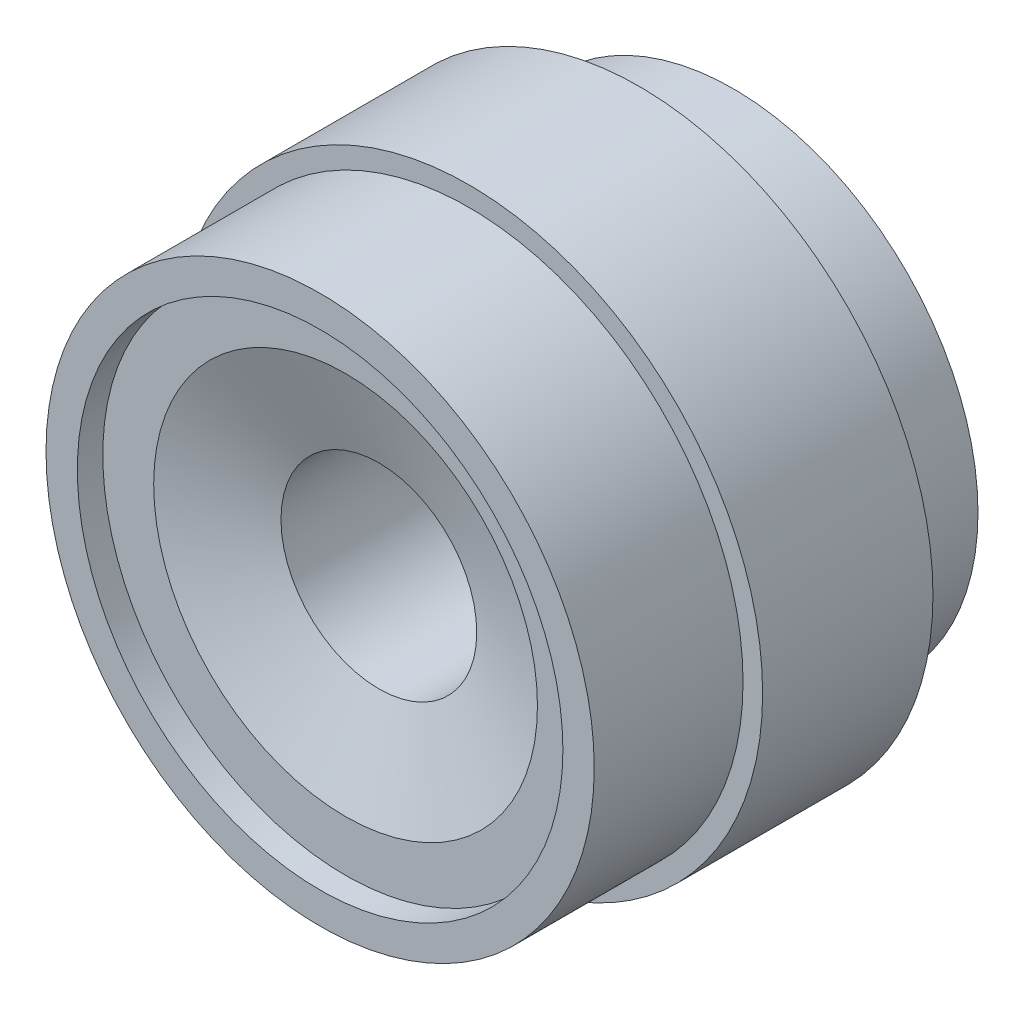
ISO-10303-21;
HEADER;
FILE_DESCRIPTION(('STEP AP214'),'2;1');
FILE_NAME('part.step','',(''),(''),'','','');
FILE_SCHEMA(('AUTOMOTIVE_DESIGN { 1 0 10303 214 1 1 1 1 }'));
ENDSEC;
DATA;
#1=APPLICATION_CONTEXT('core data for automotive mechanical design processes');
#2=APPLICATION_PROTOCOL_DEFINITION('international standard','automotive_design',2000,#1);
#3=PRODUCT_CONTEXT('',#1,'mechanical');
#4=PRODUCT('Part','Part','',(#3));
#5=PRODUCT_RELATED_PRODUCT_CATEGORY('part','',(#4));
#6=PRODUCT_DEFINITION_FORMATION('','',#4);
#7=PRODUCT_DEFINITION_CONTEXT('part definition',#1,'design');
#8=PRODUCT_DEFINITION('design','',#6,#7);
#9=PRODUCT_DEFINITION_SHAPE('','',#8);
#10=(LENGTH_UNIT() NAMED_UNIT(*) SI_UNIT(.MILLI.,.METRE.));
#11=(NAMED_UNIT(*) PLANE_ANGLE_UNIT() SI_UNIT($,.RADIAN.));
#12=(NAMED_UNIT(*) SI_UNIT($,.STERADIAN.) SOLID_ANGLE_UNIT());
#13=UNCERTAINTY_MEASURE_WITH_UNIT(LENGTH_MEASURE(1.E-05),#10,'distance_accuracy_value','');
#14=(GEOMETRIC_REPRESENTATION_CONTEXT(3) GLOBAL_UNCERTAINTY_ASSIGNED_CONTEXT((#13)) GLOBAL_UNIT_ASSIGNED_CONTEXT((#10,
#11,#12)) REPRESENTATION_CONTEXT('',''));
#15=CARTESIAN_POINT('',(0.,0.,0.));
#16=DIRECTION('',(0.,0.,1.));
#17=DIRECTION('',(1.,0.,0.));
#18=AXIS2_PLACEMENT_3D('',#15,#16,#17);
#19=CARTESIAN_POINT('',(0.,0.,13.5));
#20=DIRECTION('',(0.,0.,1.));
#21=DIRECTION('',(1.,0.,0.));
#22=AXIS2_PLACEMENT_3D('',#19,#20,#21);
#23=PLANE('',#22);
#24=CARTESIAN_POINT('',(0.,0.,13.5));
#25=DIRECTION('',(0.,0.,1.));
#26=DIRECTION('',(1.,0.,0.));
#27=AXIS2_PLACEMENT_3D('',#24,#25,#26);
#28=CIRCLE('',#27,15.);
#29=CARTESIAN_POINT('',(15.,0.,13.5));
#30=VERTEX_POINT('',#29);
#31=EDGE_CURVE('E43',#30,#30,#28,.T.);
#32=ORIENTED_EDGE('',*,*,#31,.T.);
#33=EDGE_LOOP('',(#32));
#34=FACE_BOUND('',#33,.T.);
#35=CARTESIAN_POINT('',(0.,0.,13.5));
#36=DIRECTION('',(0.,0.,1.));
#37=DIRECTION('',(1.,0.,0.));
#38=AXIS2_PLACEMENT_3D('',#35,#36,#37);
#39=CIRCLE('',#38,14.);
#40=CARTESIAN_POINT('',(-14.,0.,13.5));
#41=VERTEX_POINT('',#40);
#42=EDGE_CURVE('E51',#41,#41,#39,.T.);
#43=ORIENTED_EDGE('',*,*,#42,.F.);
#44=EDGE_LOOP('',(#43));
#45=FACE_BOUND('',#44,.T.);
#46=ADVANCED_FACE('F30',(#34,#45),#23,.T.);
#47=CARTESIAN_POINT('',(0.,0.,4.8));
#48=DIRECTION('',(0.,0.,-1.));
#49=DIRECTION('',(-1.,0.,0.));
#50=AXIS2_PLACEMENT_3D('',#47,#48,#49);
#51=CYLINDRICAL_SURFACE('',#50,12.5);
#52=CARTESIAN_POINT('',(0.,0.,4.8));
#53=DIRECTION('',(0.,0.,1.));
#54=DIRECTION('',(1.,0.,0.));
#55=AXIS2_PLACEMENT_3D('',#52,#53,#54);
#56=CIRCLE('',#55,12.5);
#57=CARTESIAN_POINT('',(12.5,0.,4.8));
#58=VERTEX_POINT('',#57);
#59=EDGE_CURVE('E10',#58,#58,#56,.T.);
#60=ORIENTED_EDGE('',*,*,#59,.F.);
#61=EDGE_LOOP('',(#60));
#62=FACE_BOUND('',#61,.T.);
#63=CARTESIAN_POINT('',(0.,0.,0.));
#64=DIRECTION('',(0.,0.,1.));
#65=DIRECTION('',(1.,0.,0.));
#66=AXIS2_PLACEMENT_3D('',#63,#64,#65);
#67=CIRCLE('',#66,12.5);
#68=CARTESIAN_POINT('',(12.5,0.,0.));
#69=VERTEX_POINT('',#68);
#70=EDGE_CURVE('E38',#69,#69,#67,.T.);
#71=ORIENTED_EDGE('',*,*,#70,.T.);
#72=EDGE_LOOP('',(#71));
#73=FACE_BOUND('',#72,.T.);
#74=ADVANCED_FACE('F32',(#62,#73),#51,.T.);
#75=CARTESIAN_POINT('',(0.,0.,0.));
#76=DIRECTION('',(0.,0.,1.));
#77=DIRECTION('',(1.,0.,0.));
#78=AXIS2_PLACEMENT_3D('',#75,#76,#77);
#79=PLANE('',#78);
#80=CARTESIAN_POINT('',(0.,0.,0.));
#81=DIRECTION('',(0.,0.,1.));
#82=DIRECTION('',(1.,0.,0.));
#83=AXIS2_PLACEMENT_3D('',#80,#81,#82);
#84=CIRCLE('',#83,5.);
#85=CARTESIAN_POINT('',(5.,0.,0.));
#86=VERTEX_POINT('',#85);
#87=EDGE_CURVE('E62',#86,#86,#84,.T.);
#88=ORIENTED_EDGE('',*,*,#87,.T.);
#89=EDGE_LOOP('',(#88));
#90=FACE_BOUND('',#89,.T.);
#91=ORIENTED_EDGE('',*,*,#70,.F.);
#92=EDGE_LOOP('',(#91));
#93=FACE_BOUND('',#92,.T.);
#94=ADVANCED_FACE('F69',(#90,#93),#79,.F.);
#95=CARTESIAN_POINT('',(0.,0.,4.8));
#96=DIRECTION('',(0.,0.,1.));
#97=DIRECTION('',(1.,0.,0.));
#98=AXIS2_PLACEMENT_3D('',#95,#96,#97);
#99=PLANE('',#98);
#100=CARTESIAN_POINT('',(0.,0.,4.8));
#101=DIRECTION('',(0.,0.,1.));
#102=DIRECTION('',(1.,0.,0.));
#103=AXIS2_PLACEMENT_3D('',#100,#101,#102);
#104=CIRCLE('',#103,15.);
#105=CARTESIAN_POINT('',(15.,0.,4.8));
#106=VERTEX_POINT('',#105);
#107=EDGE_CURVE('E45',#106,#106,#104,.T.);
#108=ORIENTED_EDGE('',*,*,#107,.F.);
#109=EDGE_LOOP('',(#108));
#110=FACE_BOUND('',#109,.T.);
#111=ORIENTED_EDGE('',*,*,#59,.T.);
#112=EDGE_LOOP('',(#111));
#113=FACE_BOUND('',#112,.T.);
#114=ADVANCED_FACE('F110',(#110,#113),#99,.F.);
#115=CARTESIAN_POINT('',(0.,0.,13.5));
#116=DIRECTION('',(0.,0.,-1.));
#117=DIRECTION('',(-1.,0.,0.));
#118=AXIS2_PLACEMENT_3D('',#115,#116,#117);
#119=CYLINDRICAL_SURFACE('',#118,15.);
#120=ORIENTED_EDGE('',*,*,#31,.F.);
#121=EDGE_LOOP('',(#120));
#122=FACE_BOUND('',#121,.T.);
#123=ORIENTED_EDGE('',*,*,#107,.T.);
#124=EDGE_LOOP('',(#123));
#125=FACE_BOUND('',#124,.T.);
#126=ADVANCED_FACE('F113',(#122,#125),#119,.T.);
#127=CARTESIAN_POINT('',(0.,0.,21.1));
#128=DIRECTION('',(0.,0.,-1.));
#129=DIRECTION('',(-1.,0.,0.));
#130=AXIS2_PLACEMENT_3D('',#127,#128,#129);
#131=CYLINDRICAL_SURFACE('',#130,14.);
#132=CARTESIAN_POINT('',(0.,0.,21.1));
#133=DIRECTION('',(0.,0.,1.));
#134=DIRECTION('',(1.,0.,0.));
#135=AXIS2_PLACEMENT_3D('',#132,#133,#134);
#136=CIRCLE('',#135,14.);
#137=CARTESIAN_POINT('',(-14.,0.,21.1));
#138=VERTEX_POINT('',#137);
#139=EDGE_CURVE('E48',#138,#138,#136,.T.);
#140=CARTESIAN_POINT('',(-14.,0.,21.1));
#141=CARTESIAN_POINT('',(-14.,0.,21.0208333333333));
#142=CARTESIAN_POINT('',(-14.,0.,20.9416666666667));
#143=CARTESIAN_POINT('',(-14.,0.,20.7833333333333));
#144=CARTESIAN_POINT('',(-14.,0.,20.7041666666667));
#145=CARTESIAN_POINT('',(-14.,0.,20.5458333333333));
#146=CARTESIAN_POINT('',(-14.,0.,20.4666666666667));
#147=CARTESIAN_POINT('',(-14.,0.,20.3083333333333));
#148=CARTESIAN_POINT('',(-14.,0.,20.2291666666667));
#149=CARTESIAN_POINT('',(-14.,0.,20.0708333333333));
#150=CARTESIAN_POINT('',(-14.,0.,19.9916666666667));
#151=CARTESIAN_POINT('',(-14.,0.,19.8333333333333));
#152=CARTESIAN_POINT('',(-14.,0.,19.7541666666667));
#153=CARTESIAN_POINT('',(-14.,0.,19.5958333333333));
#154=CARTESIAN_POINT('',(-14.,0.,19.5166666666667));
#155=CARTESIAN_POINT('',(-14.,0.,19.3583333333333));
#156=CARTESIAN_POINT('',(-14.,0.,19.2791666666667));
#157=CARTESIAN_POINT('',(-14.,0.,19.1208333333333));
#158=CARTESIAN_POINT('',(-14.,0.,19.0416666666667));
#159=CARTESIAN_POINT('',(-14.,0.,18.8833333333333));
#160=CARTESIAN_POINT('',(-14.,0.,18.8041666666667));
#161=CARTESIAN_POINT('',(-14.,0.,18.6458333333333));
#162=CARTESIAN_POINT('',(-14.,0.,18.5666666666667));
#163=CARTESIAN_POINT('',(-14.,0.,18.4083333333333));
#164=CARTESIAN_POINT('',(-14.,0.,18.3291666666667));
#165=CARTESIAN_POINT('',(-14.,0.,18.1708333333333));
#166=CARTESIAN_POINT('',(-14.,0.,18.0916666666667));
#167=CARTESIAN_POINT('',(-14.,0.,17.9333333333333));
#168=CARTESIAN_POINT('',(-14.,0.,17.8541666666667));
#169=CARTESIAN_POINT('',(-14.,0.,17.6958333333333));
#170=CARTESIAN_POINT('',(-14.,0.,17.6166666666667));
#171=CARTESIAN_POINT('',(-14.,0.,17.4583333333333));
#172=CARTESIAN_POINT('',(-14.,0.,17.3791666666667));
#173=CARTESIAN_POINT('',(-14.,0.,17.2208333333333));
#174=CARTESIAN_POINT('',(-14.,0.,17.1416666666667));
#175=CARTESIAN_POINT('',(-14.,0.,16.9833333333333));
#176=CARTESIAN_POINT('',(-14.,0.,16.9041666666667));
#177=CARTESIAN_POINT('',(-14.,0.,16.7458333333333));
#178=CARTESIAN_POINT('',(-14.,0.,16.6666666666667));
#179=CARTESIAN_POINT('',(-14.,0.,16.5083333333333));
#180=CARTESIAN_POINT('',(-14.,0.,16.4291666666667));
#181=CARTESIAN_POINT('',(-14.,0.,16.2708333333333));
#182=CARTESIAN_POINT('',(-14.,0.,16.1916666666667));
#183=CARTESIAN_POINT('',(-14.,0.,16.0333333333333));
#184=CARTESIAN_POINT('',(-14.,0.,15.9541666666667));
#185=CARTESIAN_POINT('',(-14.,0.,15.7958333333333));
#186=CARTESIAN_POINT('',(-14.,0.,15.7166666666667));
#187=CARTESIAN_POINT('',(-14.,0.,15.5583333333333));
#188=CARTESIAN_POINT('',(-14.,0.,15.4791666666667));
#189=CARTESIAN_POINT('',(-14.,0.,15.3208333333333));
#190=CARTESIAN_POINT('',(-14.,0.,15.2416666666667));
#191=CARTESIAN_POINT('',(-14.,0.,15.0833333333333));
#192=CARTESIAN_POINT('',(-14.,0.,15.0041666666667));
#193=CARTESIAN_POINT('',(-14.,0.,14.8458333333333));
#194=CARTESIAN_POINT('',(-14.,0.,14.7666666666667));
#195=CARTESIAN_POINT('',(-14.,0.,14.6083333333333));
#196=CARTESIAN_POINT('',(-14.,0.,14.5291666666667));
#197=CARTESIAN_POINT('',(-14.,0.,14.3708333333333));
#198=CARTESIAN_POINT('',(-14.,0.,14.2916666666667));
#199=CARTESIAN_POINT('',(-14.,0.,14.1333333333333));
#200=CARTESIAN_POINT('',(-14.,0.,14.0541666666667));
#201=CARTESIAN_POINT('',(-14.,0.,13.8958333333333));
#202=CARTESIAN_POINT('',(-14.,0.,13.8166666666667));
#203=CARTESIAN_POINT('',(-14.,0.,13.6583333333333));
#204=CARTESIAN_POINT('',(-14.,0.,13.5791666666667));
#205=CARTESIAN_POINT('',(-14.,0.,13.5));
#206=B_SPLINE_CURVE_WITH_KNOTS('',3,(#140,#141,#142,#143,#144,#145,#146,#147,#148,#149,#150,
#151,#152,#153,#154,#155,#156,#157,#158,#159,#160,#161,#162,#163,#164,#165,#166,#167,#168,#169,
#170,#171,#172,#173,#174,#175,#176,#177,#178,#179,#180,#181,#182,#183,#184,#185,#186,#187,#188,
#189,#190,#191,#192,#193,#194,#195,#196,#197,#198,#199,#200,#201,#202,#203,#204,#205),
.UNSPECIFIED.,.F.,.F.,(4,2,2,2,2,2,2,2,2,2,2,2,2,2,2,2,2,2,2,2,2,2,2,2,2,2,2,2,2,2,2,2,4),(0.,
0.237500000000002,0.475000000000003,0.712500000000001,0.950000000000003,1.1875,1.425,1.6625,1.9,
2.1375,2.375,2.6125,2.85,3.0875,3.325,3.5625,3.8,4.0375,4.275,4.5125,4.75,4.9875,5.225,5.4625,
5.7,5.9375,6.175,6.4125,6.65,6.8875,7.125,7.3625,7.6),.UNSPECIFIED.);
#207=EDGE_CURVE('BSEAM108',#138,#41,#206,.T.);
#208=ORIENTED_EDGE('',*,*,#139,.F.);
#209=ORIENTED_EDGE('',*,*,#42,.T.);
#210=ORIENTED_EDGE('',*,*,#207,.T.);
#211=ORIENTED_EDGE('',*,*,#207,.F.);
#212=EDGE_LOOP('',(#208,#210,#209,#211));
#213=FACE_BOUND('',#212,.T.);
#214=ADVANCED_FACE('F108',(#213),#131,.T.);
#215=CARTESIAN_POINT('',(0.,0.,21.1));
#216=DIRECTION('',(0.,0.,1.));
#217=DIRECTION('',(1.,0.,0.));
#218=AXIS2_PLACEMENT_3D('',#215,#216,#217);
#219=PLANE('',#218);
#220=CARTESIAN_POINT('',(0.,0.,21.1));
#221=DIRECTION('',(0.,0.,1.));
#222=DIRECTION('',(1.,0.,0.));
#223=AXIS2_PLACEMENT_3D('',#220,#221,#222);
#224=CIRCLE('',#223,12.4);
#225=CARTESIAN_POINT('',(12.4,0.,21.1));
#226=VERTEX_POINT('',#225);
#227=EDGE_CURVE('E34',#226,#226,#224,.T.);
#228=ORIENTED_EDGE('',*,*,#227,.F.);
#229=EDGE_LOOP('',(#228));
#230=FACE_BOUND('',#229,.T.);
#231=ORIENTED_EDGE('',*,*,#139,.T.);
#232=EDGE_LOOP('',(#231));
#233=FACE_BOUND('',#232,.T.);
#234=ADVANCED_FACE('F83',(#230,#233),#219,.T.);
#235=CARTESIAN_POINT('',(0.,0.,19.8));
#236=DIRECTION('',(0.,0.,1.));
#237=DIRECTION('',(1.,0.,0.));
#238=AXIS2_PLACEMENT_3D('',#235,#236,#237);
#239=CONICAL_SURFACE('',#238,9.8,1.23041438815299);
#240=CARTESIAN_POINT('',(0.,0.,18.1));
#241=DIRECTION('',(0.,0.,1.));
#242=DIRECTION('',(1.,0.,0.));
#243=AXIS2_PLACEMENT_3D('',#240,#241,#242);
#244=CIRCLE('',#243,5.);
#245=CARTESIAN_POINT('',(5.,0.,18.1));
#246=VERTEX_POINT('',#245);
#247=EDGE_CURVE('E63',#246,#246,#244,.T.);
#248=ORIENTED_EDGE('',*,*,#247,.F.);
#249=EDGE_LOOP('',(#248));
#250=FACE_BOUND('',#249,.T.);
#251=CARTESIAN_POINT('',(0.,0.,19.8));
#252=DIRECTION('',(0.,0.,1.));
#253=DIRECTION('',(1.,0.,0.));
#254=AXIS2_PLACEMENT_3D('',#251,#252,#253);
#255=CIRCLE('',#254,9.8);
#256=CARTESIAN_POINT('',(9.8,0.,19.8));
#257=VERTEX_POINT('',#256);
#258=EDGE_CURVE('E56',#257,#257,#255,.T.);
#259=ORIENTED_EDGE('',*,*,#258,.T.);
#260=EDGE_LOOP('',(#259));
#261=FACE_BOUND('',#260,.T.);
#262=ADVANCED_FACE('F79',(#250,#261),#239,.F.);
#263=CARTESIAN_POINT('',(9.8,0.,19.8));
#264=DIRECTION('',(0.,0.,-1.));
#265=DIRECTION('',(-1.,0.,0.));
#266=AXIS2_PLACEMENT_3D('',#263,#264,#265);
#267=PLANE('',#266);
#268=ORIENTED_EDGE('',*,*,#258,.F.);
#269=EDGE_LOOP('',(#268));
#270=FACE_BOUND('',#269,.T.);
#271=CARTESIAN_POINT('',(0.,0.,19.8));
#272=DIRECTION('',(0.,0.,1.));
#273=DIRECTION('',(1.,0.,0.));
#274=AXIS2_PLACEMENT_3D('',#271,#272,#273);
#275=CIRCLE('',#274,12.4);
#276=CARTESIAN_POINT('',(12.4,0.,19.8));
#277=VERTEX_POINT('',#276);
#278=EDGE_CURVE('E59',#277,#277,#275,.T.);
#279=ORIENTED_EDGE('',*,*,#278,.T.);
#280=EDGE_LOOP('',(#279));
#281=FACE_BOUND('',#280,.T.);
#282=ADVANCED_FACE('F82',(#270,#281),#267,.F.);
#283=CARTESIAN_POINT('',(0.,0.,21.8294791870837));
#284=DIRECTION('',(0.,0.,1.));
#285=DIRECTION('',(1.,0.,0.));
#286=AXIS2_PLACEMENT_3D('',#283,#284,#285);
#287=CYLINDRICAL_SURFACE('',#286,12.4);
#288=ORIENTED_EDGE('',*,*,#227,.T.);
#289=EDGE_LOOP('',(#288));
#290=FACE_BOUND('',#289,.T.);
#291=ORIENTED_EDGE('',*,*,#278,.F.);
#292=EDGE_LOOP('',(#291));
#293=FACE_BOUND('',#292,.T.);
#294=ADVANCED_FACE('F75',(#290,#293),#287,.F.);
#295=CARTESIAN_POINT('',(0.,0.,0.));
#296=DIRECTION('',(0.,0.,1.));
#297=DIRECTION('',(1.,0.,0.));
#298=AXIS2_PLACEMENT_3D('',#295,#296,#297);
#299=CYLINDRICAL_SURFACE('',#298,5.);
#300=ORIENTED_EDGE('',*,*,#87,.F.);
#301=EDGE_LOOP('',(#300));
#302=FACE_BOUND('',#301,.T.);
#303=ORIENTED_EDGE('',*,*,#247,.T.);
#304=EDGE_LOOP('',(#303));
#305=FACE_BOUND('',#304,.T.);
#306=ADVANCED_FACE('F72',(#302,#305),#299,.F.);
#307=CLOSED_SHELL('',(#46,#74,#94,#114,#126,#214,#234,#262,#282,#294,#306));
#308=MANIFOLD_SOLID_BREP('B2',#307);
#309=ADVANCED_BREP_SHAPE_REPRESENTATION('',(#18,#308),#14);
#310=SHAPE_DEFINITION_REPRESENTATION(#9,#309);
ENDSEC;
END-ISO-10303-21;
